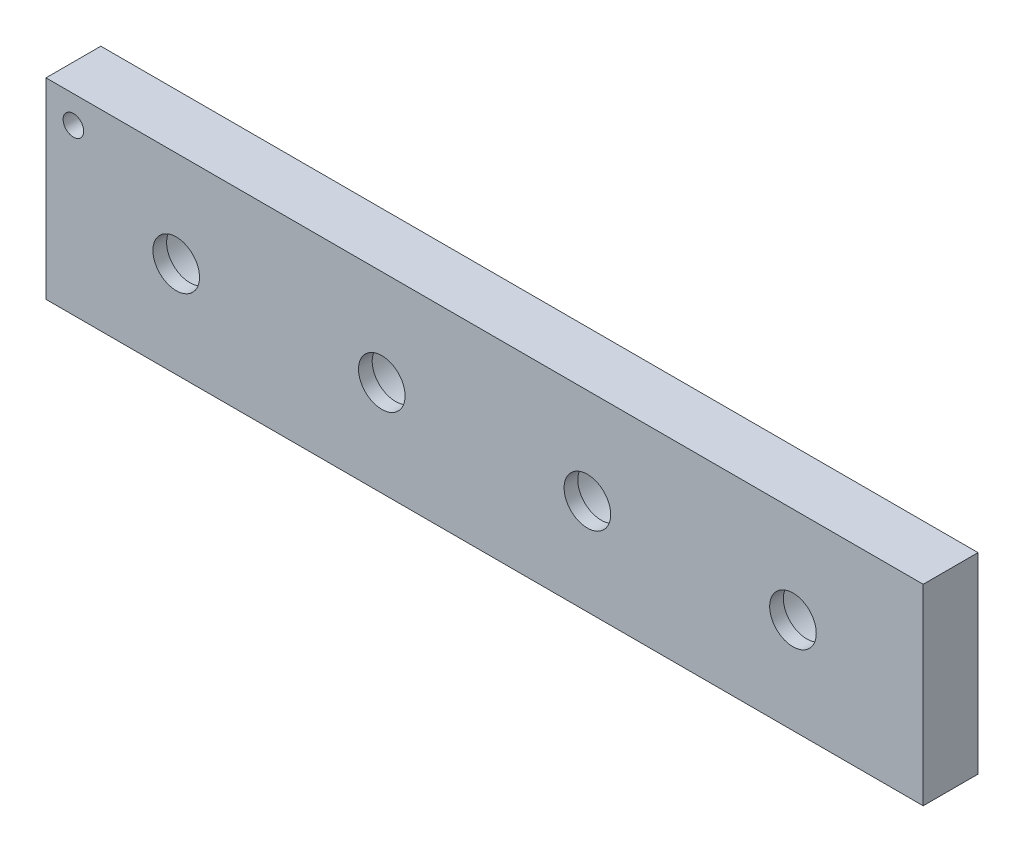
ISO-10303-21;
HEADER;
FILE_DESCRIPTION(('STEP AP214'),'2;1');
FILE_NAME('part.step','',(''),(''),'','','');
FILE_SCHEMA(('AUTOMOTIVE_DESIGN { 1 0 10303 214 1 1 1 1 }'));
ENDSEC;
DATA;
#1=APPLICATION_CONTEXT('core data for automotive mechanical design processes');
#2=APPLICATION_PROTOCOL_DEFINITION('international standard','automotive_design',2000,#1);
#3=PRODUCT_CONTEXT('',#1,'mechanical');
#4=PRODUCT('Part','Part','',(#3));
#5=PRODUCT_RELATED_PRODUCT_CATEGORY('part','',(#4));
#6=PRODUCT_DEFINITION_FORMATION('','',#4);
#7=PRODUCT_DEFINITION_CONTEXT('part definition',#1,'design');
#8=PRODUCT_DEFINITION('design','',#6,#7);
#9=PRODUCT_DEFINITION_SHAPE('','',#8);
#10=(LENGTH_UNIT() NAMED_UNIT(*) SI_UNIT(.MILLI.,.METRE.));
#11=(NAMED_UNIT(*) PLANE_ANGLE_UNIT() SI_UNIT($,.RADIAN.));
#12=(NAMED_UNIT(*) SI_UNIT($,.STERADIAN.) SOLID_ANGLE_UNIT());
#13=UNCERTAINTY_MEASURE_WITH_UNIT(LENGTH_MEASURE(1.E-05),#10,'distance_accuracy_value','');
#14=(GEOMETRIC_REPRESENTATION_CONTEXT(3) GLOBAL_UNCERTAINTY_ASSIGNED_CONTEXT((#13)) GLOBAL_UNIT_ASSIGNED_CONTEXT((#10,
#11,#12)) REPRESENTATION_CONTEXT('',''));
#15=CARTESIAN_POINT('',(0.,0.,0.));
#16=DIRECTION('',(0.,0.,1.));
#17=DIRECTION('',(1.,0.,0.));
#18=AXIS2_PLACEMENT_3D('',#15,#16,#17);
#19=CARTESIAN_POINT('',(-32.,-7.,4.00000000000001));
#20=DIRECTION('',(1.,0.,0.));
#21=DIRECTION('',(0.,0.,-1.));
#22=AXIS2_PLACEMENT_3D('',#19,#20,#21);
#23=PLANE('',#22);
#24=DIRECTION('',(0.,-1.,0.));
#25=VECTOR('',#24,1.);
#26=CARTESIAN_POINT('',(-32.,-7.,0.));
#27=LINE('',#26,#25);
#28=CARTESIAN_POINT('',(-32.,7.,0.));
#29=VERTEX_POINT('',#28);
#30=CARTESIAN_POINT('',(-32.,-7.,0.));
#31=VERTEX_POINT('',#30);
#32=EDGE_CURVE('E117',#29,#31,#27,.T.);
#33=ORIENTED_EDGE('',*,*,#32,.T.);
#34=DIRECTION('',(0.,0.,-1.));
#35=VECTOR('',#34,1.);
#36=CARTESIAN_POINT('',(-32.,-7.,4.00000000000001));
#37=LINE('',#36,#35);
#38=CARTESIAN_POINT('',(-32.,-7.,4.00000000000001));
#39=VERTEX_POINT('',#38);
#40=EDGE_CURVE('E11',#39,#31,#37,.T.);
#41=ORIENTED_EDGE('',*,*,#40,.F.);
#42=DIRECTION('',(0.,-1.,0.));
#43=VECTOR('',#42,1.);
#44=CARTESIAN_POINT('',(-32.,-7.,4.00000000000001));
#45=LINE('',#44,#43);
#46=CARTESIAN_POINT('',(-32.,7.,4.00000000000001));
#47=VERTEX_POINT('',#46);
#48=EDGE_CURVE('E97',#47,#39,#45,.T.);
#49=ORIENTED_EDGE('',*,*,#48,.F.);
#50=DIRECTION('',(0.,0.,-1.));
#51=VECTOR('',#50,1.);
#52=CARTESIAN_POINT('',(-32.,7.,4.00000000000001));
#53=LINE('',#52,#51);
#54=EDGE_CURVE('E115',#47,#29,#53,.T.);
#55=ORIENTED_EDGE('',*,*,#54,.T.);
#56=EDGE_LOOP('',(#33,#41,#49,#55));
#57=FACE_BOUND('',#56,.T.);
#58=ADVANCED_FACE('F44',(#57),#23,.F.);
#59=CARTESIAN_POINT('',(-32.,-7.,4.00000000000001));
#60=DIRECTION('',(0.,1.,0.));
#61=DIRECTION('',(0.,0.,1.));
#62=AXIS2_PLACEMENT_3D('',#59,#60,#61);
#63=PLANE('',#62);
#64=DIRECTION('',(1.,0.,0.));
#65=VECTOR('',#64,1.);
#66=CARTESIAN_POINT('',(-32.,-7.,0.));
#67=LINE('',#66,#65);
#68=CARTESIAN_POINT('',(32.,-7.,0.));
#69=VERTEX_POINT('',#68);
#70=EDGE_CURVE('E102',#31,#69,#67,.T.);
#71=ORIENTED_EDGE('',*,*,#70,.T.);
#72=DIRECTION('',(0.,0.,-1.));
#73=VECTOR('',#72,1.);
#74=CARTESIAN_POINT('',(32.,-7.,4.00000000000001));
#75=LINE('',#74,#73);
#76=CARTESIAN_POINT('',(32.,-7.,4.00000000000001));
#77=VERTEX_POINT('',#76);
#78=EDGE_CURVE('E54',#77,#69,#75,.T.);
#79=ORIENTED_EDGE('',*,*,#78,.F.);
#80=DIRECTION('',(1.,0.,0.));
#81=VECTOR('',#80,1.);
#82=CARTESIAN_POINT('',(-32.,-7.,4.00000000000001));
#83=LINE('',#82,#81);
#84=EDGE_CURVE('E94',#39,#77,#83,.T.);
#85=ORIENTED_EDGE('',*,*,#84,.F.);
#86=ORIENTED_EDGE('',*,*,#40,.T.);
#87=EDGE_LOOP('',(#71,#79,#85,#86));
#88=FACE_BOUND('',#87,.T.);
#89=ADVANCED_FACE('F103',(#88),#63,.F.);
#90=CARTESIAN_POINT('',(32.,-7.,4.00000000000001));
#91=DIRECTION('',(-1.,0.,0.));
#92=DIRECTION('',(0.,0.,1.));
#93=AXIS2_PLACEMENT_3D('',#90,#91,#92);
#94=PLANE('',#93);
#95=DIRECTION('',(0.,1.,0.));
#96=VECTOR('',#95,1.);
#97=CARTESIAN_POINT('',(32.,-7.,0.));
#98=LINE('',#97,#96);
#99=CARTESIAN_POINT('',(32.,7.,0.));
#100=VERTEX_POINT('',#99);
#101=EDGE_CURVE('E83',#69,#100,#98,.T.);
#102=ORIENTED_EDGE('',*,*,#101,.T.);
#103=DIRECTION('',(0.,0.,-1.));
#104=VECTOR('',#103,1.);
#105=CARTESIAN_POINT('',(32.,7.,4.00000000000001));
#106=LINE('',#105,#104);
#107=CARTESIAN_POINT('',(32.,7.,4.00000000000001));
#108=VERTEX_POINT('',#107);
#109=EDGE_CURVE('E106',#108,#100,#106,.T.);
#110=ORIENTED_EDGE('',*,*,#109,.F.);
#111=DIRECTION('',(0.,1.,0.));
#112=VECTOR('',#111,1.);
#113=CARTESIAN_POINT('',(32.,-7.,4.00000000000001));
#114=LINE('',#113,#112);
#115=EDGE_CURVE('E100',#77,#108,#114,.T.);
#116=ORIENTED_EDGE('',*,*,#115,.F.);
#117=ORIENTED_EDGE('',*,*,#78,.T.);
#118=EDGE_LOOP('',(#102,#110,#116,#117));
#119=FACE_BOUND('',#118,.T.);
#120=ADVANCED_FACE('F107',(#119),#94,.F.);
#121=CARTESIAN_POINT('',(-32.,7.,4.00000000000001));
#122=DIRECTION('',(0.,-1.,0.));
#123=DIRECTION('',(0.,0.,-1.));
#124=AXIS2_PLACEMENT_3D('',#121,#122,#123);
#125=PLANE('',#124);
#126=DIRECTION('',(-1.,0.,0.));
#127=VECTOR('',#126,1.);
#128=CARTESIAN_POINT('',(-32.,7.,0.));
#129=LINE('',#128,#127);
#130=EDGE_CURVE('E87',#100,#29,#129,.T.);
#131=ORIENTED_EDGE('',*,*,#130,.T.);
#132=ORIENTED_EDGE('',*,*,#54,.F.);
#133=DIRECTION('',(-1.,0.,0.));
#134=VECTOR('',#133,1.);
#135=CARTESIAN_POINT('',(-32.,7.,4.00000000000001));
#136=LINE('',#135,#134);
#137=EDGE_CURVE('E61',#108,#47,#136,.T.);
#138=ORIENTED_EDGE('',*,*,#137,.F.);
#139=ORIENTED_EDGE('',*,*,#109,.T.);
#140=EDGE_LOOP('',(#131,#132,#138,#139));
#141=FACE_BOUND('',#140,.T.);
#142=ADVANCED_FACE('F239',(#141),#125,.F.);
#143=CARTESIAN_POINT('',(0.,0.,4.00000000000001));
#144=DIRECTION('',(0.,0.,-1.));
#145=DIRECTION('',(-1.,0.,0.));
#146=AXIS2_PLACEMENT_3D('',#143,#144,#145);
#147=PLANE('',#146);
#148=CARTESIAN_POINT('',(-30.,5.,4.));
#149=DIRECTION('',(0.,0.,1.));
#150=DIRECTION('',(1.,0.,0.));
#151=AXIS2_PLACEMENT_3D('',#148,#149,#150);
#152=CIRCLE('',#151,0.750000000000001);
#153=CARTESIAN_POINT('',(-29.25,5.,4.));
#154=VERTEX_POINT('',#153);
#155=EDGE_CURVE('E199',#154,#154,#152,.T.);
#156=ORIENTED_EDGE('',*,*,#155,.F.);
#157=EDGE_LOOP('',(#156));
#158=FACE_BOUND('',#157,.T.);
#159=CARTESIAN_POINT('',(-22.5,0.,4.));
#160=DIRECTION('',(0.,0.,1.));
#161=DIRECTION('',(1.,0.,0.));
#162=AXIS2_PLACEMENT_3D('',#159,#160,#161);
#163=CIRCLE('',#162,1.7);
#164=CARTESIAN_POINT('',(-20.8,0.,4.));
#165=VERTEX_POINT('',#164);
#166=EDGE_CURVE('E138',#165,#165,#163,.T.);
#167=ORIENTED_EDGE('',*,*,#166,.F.);
#168=EDGE_LOOP('',(#167));
#169=FACE_BOUND('',#168,.T.);
#170=CARTESIAN_POINT('',(-7.5,0.,4.));
#171=DIRECTION('',(0.,0.,1.));
#172=DIRECTION('',(1.,0.,0.));
#173=AXIS2_PLACEMENT_3D('',#170,#171,#172);
#174=CIRCLE('',#173,1.7);
#175=CARTESIAN_POINT('',(-5.8,0.,4.));
#176=VERTEX_POINT('',#175);
#177=EDGE_CURVE('E191',#176,#176,#174,.T.);
#178=ORIENTED_EDGE('',*,*,#177,.F.);
#179=EDGE_LOOP('',(#178));
#180=FACE_BOUND('',#179,.T.);
#181=CARTESIAN_POINT('',(7.5,0.,4.));
#182=DIRECTION('',(0.,0.,1.));
#183=DIRECTION('',(1.,0.,0.));
#184=AXIS2_PLACEMENT_3D('',#181,#182,#183);
#185=CIRCLE('',#184,1.7);
#186=CARTESIAN_POINT('',(9.2,0.,4.));
#187=VERTEX_POINT('',#186);
#188=EDGE_CURVE('E186',#187,#187,#185,.T.);
#189=ORIENTED_EDGE('',*,*,#188,.F.);
#190=EDGE_LOOP('',(#189));
#191=FACE_BOUND('',#190,.T.);
#192=CARTESIAN_POINT('',(22.5,0.,4.));
#193=DIRECTION('',(0.,0.,1.));
#194=DIRECTION('',(1.,0.,0.));
#195=AXIS2_PLACEMENT_3D('',#192,#193,#194);
#196=CIRCLE('',#195,1.7);
#197=CARTESIAN_POINT('',(24.2,0.,4.));
#198=VERTEX_POINT('',#197);
#199=EDGE_CURVE('E183',#198,#198,#196,.T.);
#200=ORIENTED_EDGE('',*,*,#199,.F.);
#201=EDGE_LOOP('',(#200));
#202=FACE_BOUND('',#201,.T.);
#203=ORIENTED_EDGE('',*,*,#48,.T.);
#204=ORIENTED_EDGE('',*,*,#84,.T.);
#205=ORIENTED_EDGE('',*,*,#115,.T.);
#206=ORIENTED_EDGE('',*,*,#137,.T.);
#207=EDGE_LOOP('',(#203,#204,#205,#206));
#208=FACE_BOUND('',#207,.T.);
#209=ADVANCED_FACE('F92',(#158,#169,#180,#191,#202,#208),#147,.F.);
#210=CARTESIAN_POINT('',(0.,0.,0.));
#211=DIRECTION('',(0.,0.,-1.));
#212=DIRECTION('',(-1.,0.,0.));
#213=AXIS2_PLACEMENT_3D('',#210,#211,#212);
#214=PLANE('',#213);
#215=CARTESIAN_POINT('',(-30.,5.,0.));
#216=DIRECTION('',(0.,0.,-1.));
#217=DIRECTION('',(-1.,0.,0.));
#218=AXIS2_PLACEMENT_3D('',#215,#216,#217);
#219=CIRCLE('',#218,0.750000000000001);
#220=CARTESIAN_POINT('',(-30.75,5.,0.));
#221=VERTEX_POINT('',#220);
#222=EDGE_CURVE('E48',#221,#221,#219,.F.);
#223=ORIENTED_EDGE('',*,*,#222,.T.);
#224=EDGE_LOOP('',(#223));
#225=FACE_BOUND('',#224,.T.);
#226=CARTESIAN_POINT('',(-22.5,0.,0.));
#227=DIRECTION('',(0.,0.,1.));
#228=DIRECTION('',(1.,0.,0.));
#229=AXIS2_PLACEMENT_3D('',#226,#227,#228);
#230=CIRCLE('',#229,2.85);
#231=CARTESIAN_POINT('',(-19.65,0.,0.));
#232=VERTEX_POINT('',#231);
#233=EDGE_CURVE('E163',#232,#232,#230,.T.);
#234=ORIENTED_EDGE('',*,*,#233,.T.);
#235=EDGE_LOOP('',(#234));
#236=FACE_BOUND('',#235,.T.);
#237=CARTESIAN_POINT('',(-7.5,0.,0.));
#238=DIRECTION('',(0.,0.,1.));
#239=DIRECTION('',(1.,0.,0.));
#240=AXIS2_PLACEMENT_3D('',#237,#238,#239);
#241=CIRCLE('',#240,2.9);
#242=CARTESIAN_POINT('',(-4.6,0.,0.));
#243=VERTEX_POINT('',#242);
#244=EDGE_CURVE('E169',#243,#243,#241,.T.);
#245=ORIENTED_EDGE('',*,*,#244,.T.);
#246=EDGE_LOOP('',(#245));
#247=FACE_BOUND('',#246,.T.);
#248=CARTESIAN_POINT('',(7.5,0.,0.));
#249=DIRECTION('',(0.,0.,1.));
#250=DIRECTION('',(1.,0.,0.));
#251=AXIS2_PLACEMENT_3D('',#248,#249,#250);
#252=CIRCLE('',#251,2.95);
#253=CARTESIAN_POINT('',(10.45,0.,0.));
#254=VERTEX_POINT('',#253);
#255=EDGE_CURVE('E178',#254,#254,#252,.T.);
#256=ORIENTED_EDGE('',*,*,#255,.T.);
#257=EDGE_LOOP('',(#256));
#258=FACE_BOUND('',#257,.T.);
#259=CARTESIAN_POINT('',(22.5,0.,0.));
#260=DIRECTION('',(0.,0.,1.));
#261=DIRECTION('',(1.,0.,0.));
#262=AXIS2_PLACEMENT_3D('',#259,#260,#261);
#263=CIRCLE('',#262,3.);
#264=CARTESIAN_POINT('',(25.5,0.,0.));
#265=VERTEX_POINT('',#264);
#266=EDGE_CURVE('E151',#265,#265,#263,.T.);
#267=ORIENTED_EDGE('',*,*,#266,.T.);
#268=EDGE_LOOP('',(#267));
#269=FACE_BOUND('',#268,.T.);
#270=ORIENTED_EDGE('',*,*,#32,.F.);
#271=ORIENTED_EDGE('',*,*,#130,.F.);
#272=ORIENTED_EDGE('',*,*,#101,.F.);
#273=ORIENTED_EDGE('',*,*,#70,.F.);
#274=EDGE_LOOP('',(#270,#271,#272,#273));
#275=FACE_BOUND('',#274,.T.);
#276=ADVANCED_FACE('F207',(#225,#236,#247,#258,#269,#275),#214,.T.);
#277=CARTESIAN_POINT('',(22.5,0.,3.00000000000001));
#278=DIRECTION('',(0.,0.,-1.));
#279=DIRECTION('',(-1.,0.,0.));
#280=AXIS2_PLACEMENT_3D('',#277,#278,#279);
#281=CYLINDRICAL_SURFACE('',#280,3.);
#282=CARTESIAN_POINT('',(22.5,0.,3.00000000000001));
#283=DIRECTION('',(0.,0.,1.));
#284=DIRECTION('',(1.,0.,0.));
#285=AXIS2_PLACEMENT_3D('',#282,#283,#284);
#286=CIRCLE('',#285,3.);
#287=CARTESIAN_POINT('',(25.5,0.,3.00000000000001));
#288=VERTEX_POINT('',#287);
#289=EDGE_CURVE('E148',#288,#288,#286,.T.);
#290=ORIENTED_EDGE('',*,*,#289,.T.);
#291=EDGE_LOOP('',(#290));
#292=FACE_BOUND('',#291,.T.);
#293=ORIENTED_EDGE('',*,*,#266,.F.);
#294=EDGE_LOOP('',(#293));
#295=FACE_BOUND('',#294,.T.);
#296=ADVANCED_FACE('F233',(#292,#295),#281,.F.);
#297=CARTESIAN_POINT('',(22.5,0.,3.00000000000001));
#298=DIRECTION('',(0.,0.,1.));
#299=DIRECTION('',(1.,0.,0.));
#300=AXIS2_PLACEMENT_3D('',#297,#298,#299);
#301=PLANE('',#300);
#302=CARTESIAN_POINT('',(22.5,0.,3.00000000000001));
#303=DIRECTION('',(0.,0.,1.));
#304=DIRECTION('',(1.,0.,0.));
#305=AXIS2_PLACEMENT_3D('',#302,#303,#304);
#306=CIRCLE('',#305,1.7);
#307=CARTESIAN_POINT('',(24.2,0.,3.00000000000001));
#308=VERTEX_POINT('',#307);
#309=EDGE_CURVE('E141',#308,#308,#306,.F.);
#310=ORIENTED_EDGE('',*,*,#309,.F.);
#311=EDGE_LOOP('',(#310));
#312=FACE_BOUND('',#311,.T.);
#313=ORIENTED_EDGE('',*,*,#289,.F.);
#314=EDGE_LOOP('',(#313));
#315=FACE_BOUND('',#314,.T.);
#316=ADVANCED_FACE('F240',(#312,#315),#301,.F.);
#317=CARTESIAN_POINT('',(7.5,0.,3.00000000000001));
#318=DIRECTION('',(0.,0.,-1.));
#319=DIRECTION('',(-1.,0.,0.));
#320=AXIS2_PLACEMENT_3D('',#317,#318,#319);
#321=CYLINDRICAL_SURFACE('',#320,2.95);
#322=CARTESIAN_POINT('',(7.5,0.,3.00000000000001));
#323=DIRECTION('',(0.,0.,1.));
#324=DIRECTION('',(1.,0.,0.));
#325=AXIS2_PLACEMENT_3D('',#322,#323,#324);
#326=CIRCLE('',#325,2.95);
#327=CARTESIAN_POINT('',(10.45,0.,3.00000000000001));
#328=VERTEX_POINT('',#327);
#329=EDGE_CURVE('E160',#328,#328,#326,.T.);
#330=ORIENTED_EDGE('',*,*,#329,.T.);
#331=EDGE_LOOP('',(#330));
#332=FACE_BOUND('',#331,.T.);
#333=ORIENTED_EDGE('',*,*,#255,.F.);
#334=EDGE_LOOP('',(#333));
#335=FACE_BOUND('',#334,.T.);
#336=ADVANCED_FACE('F270',(#332,#335),#321,.F.);
#337=CARTESIAN_POINT('',(7.5,0.,3.00000000000001));
#338=DIRECTION('',(0.,0.,1.));
#339=DIRECTION('',(1.,0.,0.));
#340=AXIS2_PLACEMENT_3D('',#337,#338,#339);
#341=PLANE('',#340);
#342=CARTESIAN_POINT('',(7.5,0.,3.00000000000001));
#343=DIRECTION('',(0.,0.,1.));
#344=DIRECTION('',(1.,0.,0.));
#345=AXIS2_PLACEMENT_3D('',#342,#343,#344);
#346=CIRCLE('',#345,1.7);
#347=CARTESIAN_POINT('',(9.2,0.,3.00000000000001));
#348=VERTEX_POINT('',#347);
#349=EDGE_CURVE('E137',#348,#348,#346,.F.);
#350=ORIENTED_EDGE('',*,*,#349,.F.);
#351=EDGE_LOOP('',(#350));
#352=FACE_BOUND('',#351,.T.);
#353=ORIENTED_EDGE('',*,*,#329,.F.);
#354=EDGE_LOOP('',(#353));
#355=FACE_BOUND('',#354,.T.);
#356=ADVANCED_FACE('F271',(#352,#355),#341,.F.);
#357=CARTESIAN_POINT('',(-7.5,0.,3.00000000000001));
#358=DIRECTION('',(0.,0.,-1.));
#359=DIRECTION('',(-1.,0.,0.));
#360=AXIS2_PLACEMENT_3D('',#357,#358,#359);
#361=CYLINDRICAL_SURFACE('',#360,2.9);
#362=CARTESIAN_POINT('',(-7.5,0.,3.00000000000001));
#363=DIRECTION('',(0.,0.,1.));
#364=DIRECTION('',(1.,0.,0.));
#365=AXIS2_PLACEMENT_3D('',#362,#363,#364);
#366=CIRCLE('',#365,2.9);
#367=CARTESIAN_POINT('',(-4.6,0.,3.00000000000001));
#368=VERTEX_POINT('',#367);
#369=EDGE_CURVE('E175',#368,#368,#366,.T.);
#370=ORIENTED_EDGE('',*,*,#369,.T.);
#371=EDGE_LOOP('',(#370));
#372=FACE_BOUND('',#371,.T.);
#373=ORIENTED_EDGE('',*,*,#244,.F.);
#374=EDGE_LOOP('',(#373));
#375=FACE_BOUND('',#374,.T.);
#376=ADVANCED_FACE('F280',(#372,#375),#361,.F.);
#377=CARTESIAN_POINT('',(-7.5,0.,3.00000000000001));
#378=DIRECTION('',(0.,0.,1.));
#379=DIRECTION('',(1.,0.,0.));
#380=AXIS2_PLACEMENT_3D('',#377,#378,#379);
#381=PLANE('',#380);
#382=CARTESIAN_POINT('',(-7.5,0.,3.00000000000001));
#383=DIRECTION('',(0.,0.,1.));
#384=DIRECTION('',(1.,0.,0.));
#385=AXIS2_PLACEMENT_3D('',#382,#383,#384);
#386=CIRCLE('',#385,1.7);
#387=CARTESIAN_POINT('',(-5.8,0.,3.00000000000001));
#388=VERTEX_POINT('',#387);
#389=EDGE_CURVE('E133',#388,#388,#386,.F.);
#390=ORIENTED_EDGE('',*,*,#389,.F.);
#391=EDGE_LOOP('',(#390));
#392=FACE_BOUND('',#391,.T.);
#393=ORIENTED_EDGE('',*,*,#369,.F.);
#394=EDGE_LOOP('',(#393));
#395=FACE_BOUND('',#394,.T.);
#396=ADVANCED_FACE('F282',(#392,#395),#381,.F.);
#397=CARTESIAN_POINT('',(-22.5,0.,3.00000000000001));
#398=DIRECTION('',(0.,0.,-1.));
#399=DIRECTION('',(-1.,0.,0.));
#400=AXIS2_PLACEMENT_3D('',#397,#398,#399);
#401=CYLINDRICAL_SURFACE('',#400,2.85);
#402=CARTESIAN_POINT('',(-22.5,0.,3.00000000000001));
#403=DIRECTION('',(0.,0.,1.));
#404=DIRECTION('',(1.,0.,0.));
#405=AXIS2_PLACEMENT_3D('',#402,#403,#404);
#406=CIRCLE('',#405,2.85);
#407=CARTESIAN_POINT('',(-19.65,0.,3.00000000000001));
#408=VERTEX_POINT('',#407);
#409=EDGE_CURVE('E118',#408,#408,#406,.T.);
#410=ORIENTED_EDGE('',*,*,#409,.T.);
#411=EDGE_LOOP('',(#410));
#412=FACE_BOUND('',#411,.T.);
#413=ORIENTED_EDGE('',*,*,#233,.F.);
#414=EDGE_LOOP('',(#413));
#415=FACE_BOUND('',#414,.T.);
#416=ADVANCED_FACE('F286',(#412,#415),#401,.F.);
#417=CARTESIAN_POINT('',(-22.5,0.,3.00000000000001));
#418=DIRECTION('',(0.,0.,1.));
#419=DIRECTION('',(1.,0.,0.));
#420=AXIS2_PLACEMENT_3D('',#417,#418,#419);
#421=PLANE('',#420);
#422=CARTESIAN_POINT('',(-22.5,0.,3.00000000000001));
#423=DIRECTION('',(0.,0.,1.));
#424=DIRECTION('',(1.,0.,0.));
#425=AXIS2_PLACEMENT_3D('',#422,#423,#424);
#426=CIRCLE('',#425,1.7);
#427=CARTESIAN_POINT('',(-20.8,0.,3.00000000000001));
#428=VERTEX_POINT('',#427);
#429=EDGE_CURVE('E132',#428,#428,#426,.F.);
#430=ORIENTED_EDGE('',*,*,#429,.F.);
#431=EDGE_LOOP('',(#430));
#432=FACE_BOUND('',#431,.T.);
#433=ORIENTED_EDGE('',*,*,#409,.F.);
#434=EDGE_LOOP('',(#433));
#435=FACE_BOUND('',#434,.T.);
#436=ADVANCED_FACE('F295',(#432,#435),#421,.F.);
#437=CARTESIAN_POINT('',(-22.5,0.,4.));
#438=DIRECTION('',(0.,0.,-1.));
#439=DIRECTION('',(-1.,0.,0.));
#440=AXIS2_PLACEMENT_3D('',#437,#438,#439);
#441=CYLINDRICAL_SURFACE('',#440,1.7);
#442=ORIENTED_EDGE('',*,*,#166,.T.);
#443=EDGE_LOOP('',(#442));
#444=FACE_BOUND('',#443,.T.);
#445=ORIENTED_EDGE('',*,*,#429,.T.);
#446=EDGE_LOOP('',(#445));
#447=FACE_BOUND('',#446,.T.);
#448=ADVANCED_FACE('F321',(#444,#447),#441,.F.);
#449=CARTESIAN_POINT('',(-7.5,0.,4.));
#450=DIRECTION('',(0.,0.,-1.));
#451=DIRECTION('',(-1.,0.,0.));
#452=AXIS2_PLACEMENT_3D('',#449,#450,#451);
#453=CYLINDRICAL_SURFACE('',#452,1.7);
#454=ORIENTED_EDGE('',*,*,#177,.T.);
#455=EDGE_LOOP('',(#454));
#456=FACE_BOUND('',#455,.T.);
#457=ORIENTED_EDGE('',*,*,#389,.T.);
#458=EDGE_LOOP('',(#457));
#459=FACE_BOUND('',#458,.T.);
#460=ADVANCED_FACE('F329',(#456,#459),#453,.F.);
#461=CARTESIAN_POINT('',(7.5,0.,4.));
#462=DIRECTION('',(0.,0.,-1.));
#463=DIRECTION('',(-1.,0.,0.));
#464=AXIS2_PLACEMENT_3D('',#461,#462,#463);
#465=CYLINDRICAL_SURFACE('',#464,1.7);
#466=ORIENTED_EDGE('',*,*,#188,.T.);
#467=EDGE_LOOP('',(#466));
#468=FACE_BOUND('',#467,.T.);
#469=ORIENTED_EDGE('',*,*,#349,.T.);
#470=EDGE_LOOP('',(#469));
#471=FACE_BOUND('',#470,.T.);
#472=ADVANCED_FACE('F219',(#468,#471),#465,.F.);
#473=CARTESIAN_POINT('',(22.5,0.,4.));
#474=DIRECTION('',(0.,0.,-1.));
#475=DIRECTION('',(-1.,0.,0.));
#476=AXIS2_PLACEMENT_3D('',#473,#474,#475);
#477=CYLINDRICAL_SURFACE('',#476,1.7);
#478=ORIENTED_EDGE('',*,*,#199,.T.);
#479=EDGE_LOOP('',(#478));
#480=FACE_BOUND('',#479,.T.);
#481=ORIENTED_EDGE('',*,*,#309,.T.);
#482=EDGE_LOOP('',(#481));
#483=FACE_BOUND('',#482,.T.);
#484=ADVANCED_FACE('F212',(#480,#483),#477,.F.);
#485=CARTESIAN_POINT('',(-30.,5.,4.));
#486=DIRECTION('',(0.,0.,-1.));
#487=DIRECTION('',(-1.,0.,0.));
#488=AXIS2_PLACEMENT_3D('',#485,#486,#487);
#489=CYLINDRICAL_SURFACE('',#488,0.750000000000001);
#490=ORIENTED_EDGE('',*,*,#222,.F.);
#491=EDGE_LOOP('',(#490));
#492=FACE_BOUND('',#491,.T.);
#493=ORIENTED_EDGE('',*,*,#155,.T.);
#494=EDGE_LOOP('',(#493));
#495=FACE_BOUND('',#494,.T.);
#496=ADVANCED_FACE('F215',(#492,#495),#489,.F.);
#497=CLOSED_SHELL('',(#58,#89,#120,#142,#209,#276,#296,#316,#336,#356,#376,#396,#416,#436,#448,
#460,#472,#484,#496));
#498=MANIFOLD_SOLID_BREP('B2',#497);
#499=ADVANCED_BREP_SHAPE_REPRESENTATION('',(#18,#498),#14);
#500=SHAPE_DEFINITION_REPRESENTATION(#9,#499);
ENDSEC;
END-ISO-10303-21;
